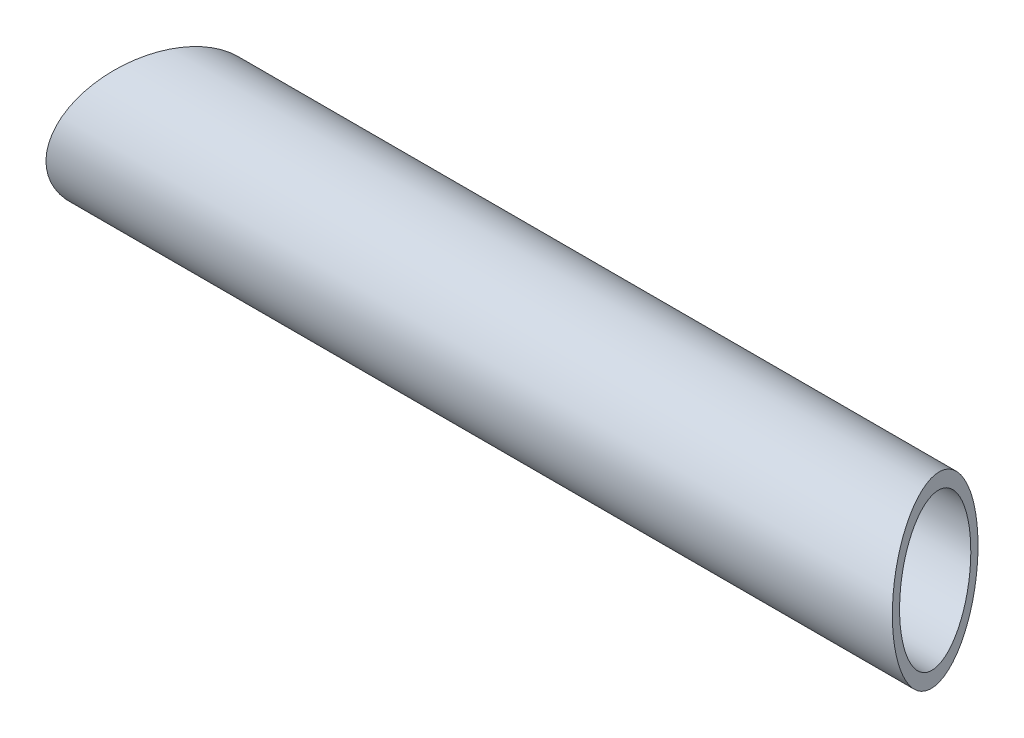
ISO-10303-21;
HEADER;
FILE_DESCRIPTION(('STEP AP214'),'2;1');
FILE_NAME('part.step','',(''),(''),'','','');
FILE_SCHEMA(('AUTOMOTIVE_DESIGN { 1 0 10303 214 1 1 1 1 }'));
ENDSEC;
DATA;
#1=APPLICATION_CONTEXT('core data for automotive mechanical design processes');
#2=APPLICATION_PROTOCOL_DEFINITION('international standard','automotive_design',2000,#1);
#3=PRODUCT_CONTEXT('',#1,'mechanical');
#4=PRODUCT('Part','Part','',(#3));
#5=PRODUCT_RELATED_PRODUCT_CATEGORY('part','',(#4));
#6=PRODUCT_DEFINITION_FORMATION('','',#4);
#7=PRODUCT_DEFINITION_CONTEXT('part definition',#1,'design');
#8=PRODUCT_DEFINITION('design','',#6,#7);
#9=PRODUCT_DEFINITION_SHAPE('','',#8);
#10=(LENGTH_UNIT() NAMED_UNIT(*) SI_UNIT(.MILLI.,.METRE.));
#11=(NAMED_UNIT(*) PLANE_ANGLE_UNIT() SI_UNIT($,.RADIAN.));
#12=(NAMED_UNIT(*) SI_UNIT($,.STERADIAN.) SOLID_ANGLE_UNIT());
#13=UNCERTAINTY_MEASURE_WITH_UNIT(LENGTH_MEASURE(1.E-05),#10,'distance_accuracy_value','');
#14=(GEOMETRIC_REPRESENTATION_CONTEXT(3) GLOBAL_UNCERTAINTY_ASSIGNED_CONTEXT((#13)) GLOBAL_UNIT_ASSIGNED_CONTEXT((#10,
#11,#12)) REPRESENTATION_CONTEXT('',''));
#15=CARTESIAN_POINT('',(0.,0.,0.));
#16=DIRECTION('',(0.,0.,1.));
#17=DIRECTION('',(1.,0.,0.));
#18=AXIS2_PLACEMENT_3D('',#15,#16,#17);
#19=CARTESIAN_POINT('',(-50.,130.,0.));
#20=DIRECTION('',(1.,0.,0.));
#21=DIRECTION('',(0.,1.,0.));
#22=AXIS2_PLACEMENT_3D('',#19,#20,#21);
#23=CYLINDRICAL_SURFACE('',#22,7.9);
#24=CARTESIAN_POINT('',(-50.,130.,0.));
#25=DIRECTION('',(-0.904650427063292,0.140780299510551,-0.402229427173004));
#26=DIRECTION('',(0.426154437750217,0.298851652810821,-0.853861865173774));
#27=AXIS2_PLACEMENT_3D('',#24,#25,#26);
#28=ELLIPSE('',#27,8.73265491693323,7.9);
#29=CARTESIAN_POINT('',(-46.2785403538077,132.609768355352,-7.45648101529144));
#30=VERTEX_POINT('',#29);
#31=EDGE_CURVE('E51',#30,#30,#28,.T.);
#32=ORIENTED_EDGE('',*,*,#31,.T.);
#33=EDGE_LOOP('',(#32));
#34=FACE_BOUND('',#33,.T.);
#35=CARTESIAN_POINT('',(50.,130.,0.));
#36=DIRECTION('',(0.904650427063292,0.140780299510552,-0.402229427173004));
#37=DIRECTION('',(0.426154437750217,-0.298851652810821,0.853861865173774));
#38=AXIS2_PLACEMENT_3D('',#35,#36,#37);
#39=ELLIPSE('',#38,8.73265491693323,7.9);
#40=CARTESIAN_POINT('',(53.7214596461924,127.390231644648,7.45648101529163));
#41=VERTEX_POINT('',#40);
#42=EDGE_CURVE('E41',#41,#41,#39,.T.);
#43=ORIENTED_EDGE('',*,*,#42,.T.);
#44=EDGE_LOOP('',(#43));
#45=FACE_BOUND('',#44,.T.);
#46=ADVANCED_FACE('F37',(#34,#45),#23,.F.);
#47=CARTESIAN_POINT('',(-50.,130.,0.));
#48=DIRECTION('',(1.,0.,0.));
#49=DIRECTION('',(0.,1.,0.));
#50=AXIS2_PLACEMENT_3D('',#47,#48,#49);
#51=CYLINDRICAL_SURFACE('',#50,9.5);
#52=CARTESIAN_POINT('',(-50.,130.,0.));
#53=DIRECTION('',(-0.904650427063292,0.140780299510551,-0.402229427173004));
#54=DIRECTION('',(0.426154437750217,0.298851652810821,-0.853861865173774));
#55=AXIS2_PLACEMENT_3D('',#52,#53,#54);
#56=ELLIPSE('',#55,10.5012938874513,9.5);
#57=CARTESIAN_POINT('',(-45.5248270077434,133.138329034917,-8.96665438547706));
#58=VERTEX_POINT('',#57);
#59=EDGE_CURVE('E45',#58,#58,#56,.T.);
#60=ORIENTED_EDGE('',*,*,#59,.F.);
#61=EDGE_LOOP('',(#60));
#62=FACE_BOUND('',#61,.T.);
#63=CARTESIAN_POINT('',(50.,130.,0.));
#64=DIRECTION('',(0.904650427063292,0.140780299510552,-0.402229427173004));
#65=DIRECTION('',(0.426154437750217,-0.298851652810821,0.853861865173774));
#66=AXIS2_PLACEMENT_3D('',#63,#64,#65);
#67=ELLIPSE('',#66,10.5012938874513,9.5);
#68=CARTESIAN_POINT('',(54.4751729922567,126.861670965083,8.96665438547725));
#69=VERTEX_POINT('',#68);
#70=EDGE_CURVE('E10',#69,#69,#67,.T.);
#71=ORIENTED_EDGE('',*,*,#70,.F.);
#72=EDGE_LOOP('',(#71));
#73=FACE_BOUND('',#72,.T.);
#74=ADVANCED_FACE('F65',(#62,#73),#51,.T.);
#75=CARTESIAN_POINT('',(-50.,130.,0.));
#76=DIRECTION('',(-0.904650427063292,0.140780299510551,-0.402229427173004));
#77=DIRECTION('',(-0.406275581998161,0.,0.913750595880548));
#78=AXIS2_PLACEMENT_3D('',#75,#76,#77);
#79=PLANE('',#78);
#80=ORIENTED_EDGE('',*,*,#31,.F.);
#81=EDGE_LOOP('',(#80));
#82=FACE_BOUND('',#81,.T.);
#83=ORIENTED_EDGE('',*,*,#59,.T.);
#84=EDGE_LOOP('',(#83));
#85=FACE_BOUND('',#84,.T.);
#86=ADVANCED_FACE('F60',(#82,#85),#79,.T.);
#87=CARTESIAN_POINT('',(50.,130.,0.));
#88=DIRECTION('',(0.904650427063292,0.140780299510552,-0.402229427173004));
#89=DIRECTION('',(-0.406275581998161,0.,-0.913750595880547));
#90=AXIS2_PLACEMENT_3D('',#87,#88,#89);
#91=PLANE('',#90);
#92=ORIENTED_EDGE('',*,*,#42,.F.);
#93=EDGE_LOOP('',(#92));
#94=FACE_BOUND('',#93,.T.);
#95=ORIENTED_EDGE('',*,*,#70,.T.);
#96=EDGE_LOOP('',(#95));
#97=FACE_BOUND('',#96,.T.);
#98=ADVANCED_FACE('F39',(#94,#97),#91,.T.);
#99=CLOSED_SHELL('',(#46,#74,#86,#98));
#100=MANIFOLD_SOLID_BREP('B2',#99);
#101=ADVANCED_BREP_SHAPE_REPRESENTATION('',(#18,#100),#14);
#102=SHAPE_DEFINITION_REPRESENTATION(#9,#101);
ENDSEC;
END-ISO-10303-21;
